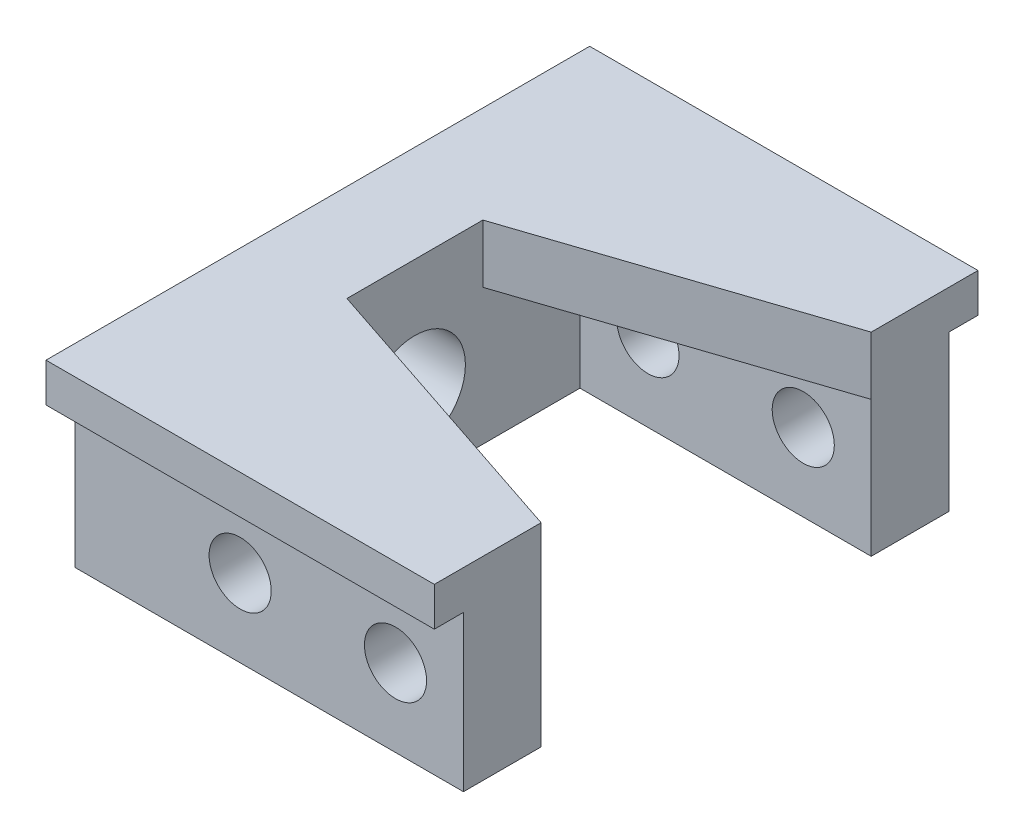
ISO-10303-21;
HEADER;
FILE_DESCRIPTION(('STEP AP214'),'2;1');
FILE_NAME('part.step','',(''),(''),'','','');
FILE_SCHEMA(('AUTOMOTIVE_DESIGN { 1 0 10303 214 1 1 1 1 }'));
ENDSEC;
DATA;
#1=APPLICATION_CONTEXT('core data for automotive mechanical design processes');
#2=APPLICATION_PROTOCOL_DEFINITION('international standard','automotive_design',2000,#1);
#3=PRODUCT_CONTEXT('',#1,'mechanical');
#4=PRODUCT('Part','Part','',(#3));
#5=PRODUCT_RELATED_PRODUCT_CATEGORY('part','',(#4));
#6=PRODUCT_DEFINITION_FORMATION('','',#4);
#7=PRODUCT_DEFINITION_CONTEXT('part definition',#1,'design');
#8=PRODUCT_DEFINITION('design','',#6,#7);
#9=PRODUCT_DEFINITION_SHAPE('','',#8);
#10=(LENGTH_UNIT() NAMED_UNIT(*) SI_UNIT(.MILLI.,.METRE.));
#11=(NAMED_UNIT(*) PLANE_ANGLE_UNIT() SI_UNIT($,.RADIAN.));
#12=(NAMED_UNIT(*) SI_UNIT($,.STERADIAN.) SOLID_ANGLE_UNIT());
#13=UNCERTAINTY_MEASURE_WITH_UNIT(LENGTH_MEASURE(1.E-05),#10,'distance_accuracy_value','');
#14=(GEOMETRIC_REPRESENTATION_CONTEXT(3) GLOBAL_UNCERTAINTY_ASSIGNED_CONTEXT((#13)) GLOBAL_UNIT_ASSIGNED_CONTEXT((#10,
#11,#12)) REPRESENTATION_CONTEXT('',''));
#15=CARTESIAN_POINT('',(0.,0.,0.));
#16=DIRECTION('',(0.,0.,1.));
#17=DIRECTION('',(1.,0.,0.));
#18=AXIS2_PLACEMENT_3D('',#15,#16,#17);
#19=CARTESIAN_POINT('',(5.,0.,0.));
#20=DIRECTION('',(1.,0.,0.));
#21=DIRECTION('',(0.,0.,-1.));
#22=AXIS2_PLACEMENT_3D('',#19,#20,#21);
#23=PLANE('',#22);
#24=DIRECTION('',(0.,0.,1.));
#25=VECTOR('',#24,1.);
#26=CARTESIAN_POINT('',(5.,-2.5,0.));
#27=LINE('',#26,#25);
#28=CARTESIAN_POINT('',(5.,-2.5,-8.5));
#29=VERTEX_POINT('',#28);
#30=CARTESIAN_POINT('',(5.,-2.5,8.5));
#31=VERTEX_POINT('',#30);
#32=EDGE_CURVE('E314',#29,#31,#27,.T.);
#33=ORIENTED_EDGE('',*,*,#32,.F.);
#34=DIRECTION('',(0.,-1.,0.));
#35=VECTOR('',#34,1.);
#36=CARTESIAN_POINT('',(5.,-5.5,-8.5));
#37=LINE('',#36,#35);
#38=CARTESIAN_POINT('',(5.,4.5,-8.5));
#39=VERTEX_POINT('',#38);
#40=EDGE_CURVE('E177',#39,#29,#37,.T.);
#41=ORIENTED_EDGE('',*,*,#40,.F.);
#42=DIRECTION('',(0.,0.,-1.));
#43=VECTOR('',#42,1.);
#44=CARTESIAN_POINT('',(5.,4.5,-8.5));
#45=LINE('',#44,#43);
#46=CARTESIAN_POINT('',(5.,4.5,-3.5));
#47=VERTEX_POINT('',#46);
#48=EDGE_CURVE('E291',#47,#39,#45,.T.);
#49=ORIENTED_EDGE('',*,*,#48,.F.);
#50=DIRECTION('',(0.,1.,0.));
#51=VECTOR('',#50,1.);
#52=CARTESIAN_POINT('',(5.,4.5,-3.5));
#53=LINE('',#52,#51);
#54=CARTESIAN_POINT('',(5.,7.5,-3.5));
#55=VERTEX_POINT('',#54);
#56=EDGE_CURVE('E289',#47,#55,#53,.T.);
#57=ORIENTED_EDGE('',*,*,#56,.T.);
#58=DIRECTION('',(0.,0.,-1.));
#59=VECTOR('',#58,1.);
#60=CARTESIAN_POINT('',(5.,7.5,-8.5));
#61=LINE('',#60,#59);
#62=CARTESIAN_POINT('',(5.,7.5,3.5));
#63=VERTEX_POINT('',#62);
#64=EDGE_CURVE('E245',#63,#55,#61,.T.);
#65=ORIENTED_EDGE('',*,*,#64,.F.);
#66=DIRECTION('',(0.,1.,0.));
#67=VECTOR('',#66,1.);
#68=CARTESIAN_POINT('',(5.,4.5,3.5));
#69=LINE('',#68,#67);
#70=CARTESIAN_POINT('',(5.,4.5,3.5));
#71=VERTEX_POINT('',#70);
#72=EDGE_CURVE('E242',#71,#63,#69,.T.);
#73=ORIENTED_EDGE('',*,*,#72,.F.);
#74=DIRECTION('',(0.,0.,-1.));
#75=VECTOR('',#74,1.);
#76=CARTESIAN_POINT('',(5.,4.5,8.5));
#77=LINE('',#76,#75);
#78=CARTESIAN_POINT('',(5.,4.5,8.5));
#79=VERTEX_POINT('',#78);
#80=EDGE_CURVE('E305',#79,#71,#77,.T.);
#81=ORIENTED_EDGE('',*,*,#80,.F.);
#82=DIRECTION('',(0.,1.,0.));
#83=VECTOR('',#82,1.);
#84=CARTESIAN_POINT('',(5.,-5.5,8.5));
#85=LINE('',#84,#83);
#86=EDGE_CURVE('E170',#31,#79,#85,.T.);
#87=ORIENTED_EDGE('',*,*,#86,.F.);
#88=EDGE_LOOP('',(#33,#41,#49,#57,#65,#73,#81,#87));
#89=FACE_BOUND('',#88,.T.);
#90=CARTESIAN_POINT('',(5.,1.5,0.));
#91=DIRECTION('',(1.,0.,0.));
#92=DIRECTION('',(0.,0.,-1.));
#93=AXIS2_PLACEMENT_3D('',#90,#91,#92);
#94=CIRCLE('',#93,2.6);
#95=CARTESIAN_POINT('',(5.,1.5,-2.6));
#96=VERTEX_POINT('',#95);
#97=EDGE_CURVE('E180',#96,#96,#94,.T.);
#98=ORIENTED_EDGE('',*,*,#97,.F.);
#99=EDGE_LOOP('',(#98));
#100=FACE_BOUND('',#99,.T.);
#101=ADVANCED_FACE('F36',(#89,#100),#23,.T.);
#102=CARTESIAN_POINT('',(20.,-5.5,-8.5));
#103=DIRECTION('',(0.,0.,-1.));
#104=DIRECTION('',(-1.,0.,0.));
#105=AXIS2_PLACEMENT_3D('',#102,#103,#104);
#106=PLANE('',#105);
#107=CARTESIAN_POINT('',(8.5,1.5,-8.5));
#108=DIRECTION('',(0.,0.,-1.));
#109=DIRECTION('',(-1.,0.,0.));
#110=AXIS2_PLACEMENT_3D('',#107,#108,#109);
#111=CIRCLE('',#110,1.6);
#112=CARTESIAN_POINT('',(6.9,1.5,-8.5));
#113=VERTEX_POINT('',#112);
#114=EDGE_CURVE('E188',#113,#113,#111,.T.);
#115=ORIENTED_EDGE('',*,*,#114,.T.);
#116=EDGE_LOOP('',(#115));
#117=FACE_BOUND('',#116,.T.);
#118=CARTESIAN_POINT('',(16.5,1.5,-8.5));
#119=DIRECTION('',(0.,0.,-1.));
#120=DIRECTION('',(-1.,0.,0.));
#121=AXIS2_PLACEMENT_3D('',#118,#119,#120);
#122=CIRCLE('',#121,1.6);
#123=CARTESIAN_POINT('',(14.9,1.5,-8.5));
#124=VERTEX_POINT('',#123);
#125=EDGE_CURVE('E40',#124,#124,#122,.T.);
#126=ORIENTED_EDGE('',*,*,#125,.T.);
#127=EDGE_LOOP('',(#126));
#128=FACE_BOUND('',#127,.T.);
#129=ORIENTED_EDGE('',*,*,#40,.T.);
#130=DIRECTION('',(1.,0.,0.));
#131=VECTOR('',#130,1.);
#132=CARTESIAN_POINT('',(20.,-2.5,-8.5));
#133=LINE('',#132,#131);
#134=CARTESIAN_POINT('',(20.,-2.5,-8.5));
#135=VERTEX_POINT('',#134);
#136=EDGE_CURVE('E319',#29,#135,#133,.T.);
#137=ORIENTED_EDGE('',*,*,#136,.T.);
#138=DIRECTION('',(0.,-1.,0.));
#139=VECTOR('',#138,1.);
#140=CARTESIAN_POINT('',(20.,-5.5,-8.5));
#141=LINE('',#140,#139);
#142=CARTESIAN_POINT('',(20.,4.5,-8.5));
#143=VERTEX_POINT('',#142);
#144=EDGE_CURVE('E218',#143,#135,#141,.T.);
#145=ORIENTED_EDGE('',*,*,#144,.F.);
#146=DIRECTION('',(1.,0.,0.));
#147=VECTOR('',#146,1.);
#148=CARTESIAN_POINT('',(20.,4.5,-8.5));
#149=LINE('',#148,#147);
#150=EDGE_CURVE('E326',#39,#143,#149,.T.);
#151=ORIENTED_EDGE('',*,*,#150,.F.);
#152=EDGE_LOOP('',(#129,#137,#145,#151));
#153=FACE_BOUND('',#152,.T.);
#154=ADVANCED_FACE('F343',(#117,#128,#153),#106,.F.);
#155=CARTESIAN_POINT('',(20.,-5.5,8.5));
#156=DIRECTION('',(0.,0.,1.));
#157=DIRECTION('',(1.,0.,0.));
#158=AXIS2_PLACEMENT_3D('',#155,#156,#157);
#159=PLANE('',#158);
#160=CARTESIAN_POINT('',(8.5,1.5,8.5));
#161=DIRECTION('',(0.,0.,1.));
#162=DIRECTION('',(1.,0.,0.));
#163=AXIS2_PLACEMENT_3D('',#160,#161,#162);
#164=CIRCLE('',#163,1.6);
#165=CARTESIAN_POINT('',(10.1,1.5,8.5));
#166=VERTEX_POINT('',#165);
#167=EDGE_CURVE('E190',#166,#166,#164,.T.);
#168=ORIENTED_EDGE('',*,*,#167,.T.);
#169=EDGE_LOOP('',(#168));
#170=FACE_BOUND('',#169,.T.);
#171=CARTESIAN_POINT('',(16.5,1.5,8.5));
#172=DIRECTION('',(0.,0.,1.));
#173=DIRECTION('',(1.,0.,0.));
#174=AXIS2_PLACEMENT_3D('',#171,#172,#173);
#175=CIRCLE('',#174,1.6);
#176=CARTESIAN_POINT('',(18.1,1.5,8.5));
#177=VERTEX_POINT('',#176);
#178=EDGE_CURVE('E213',#177,#177,#175,.T.);
#179=ORIENTED_EDGE('',*,*,#178,.T.);
#180=EDGE_LOOP('',(#179));
#181=FACE_BOUND('',#180,.T.);
#182=DIRECTION('',(0.,1.,0.));
#183=VECTOR('',#182,1.);
#184=CARTESIAN_POINT('',(20.,-5.5,8.5));
#185=LINE('',#184,#183);
#186=CARTESIAN_POINT('',(20.,-2.5,8.5));
#187=VERTEX_POINT('',#186);
#188=CARTESIAN_POINT('',(20.,4.5,8.5));
#189=VERTEX_POINT('',#188);
#190=EDGE_CURVE('E169',#187,#189,#185,.T.);
#191=ORIENTED_EDGE('',*,*,#190,.F.);
#192=DIRECTION('',(-1.,0.,0.));
#193=VECTOR('',#192,1.);
#194=CARTESIAN_POINT('',(20.,-2.5,8.5));
#195=LINE('',#194,#193);
#196=EDGE_CURVE('E150',#187,#31,#195,.T.);
#197=ORIENTED_EDGE('',*,*,#196,.T.);
#198=ORIENTED_EDGE('',*,*,#86,.T.);
#199=DIRECTION('',(-1.,0.,0.));
#200=VECTOR('',#199,1.);
#201=CARTESIAN_POINT('',(20.,4.5,8.5));
#202=LINE('',#201,#200);
#203=EDGE_CURVE('E302',#189,#79,#202,.T.);
#204=ORIENTED_EDGE('',*,*,#203,.F.);
#205=EDGE_LOOP('',(#191,#197,#198,#204));
#206=FACE_BOUND('',#205,.T.);
#207=ADVANCED_FACE('F317',(#170,#181,#206),#159,.F.);
#208=CARTESIAN_POINT('',(0.,0.,0.));
#209=DIRECTION('',(1.,0.,0.));
#210=DIRECTION('',(0.,0.,-1.));
#211=AXIS2_PLACEMENT_3D('',#208,#209,#210);
#212=PLANE('',#211);
#213=DIRECTION('',(0.,1.,0.));
#214=VECTOR('',#213,1.);
#215=CARTESIAN_POINT('',(0.,-5.5,-12.5));
#216=LINE('',#215,#214);
#217=CARTESIAN_POINT('',(0.,-2.5,-12.5));
#218=VERTEX_POINT('',#217);
#219=CARTESIAN_POINT('',(0.,5.5,-12.5));
#220=VERTEX_POINT('',#219);
#221=EDGE_CURVE('E186',#218,#220,#216,.T.);
#222=ORIENTED_EDGE('',*,*,#221,.F.);
#223=DIRECTION('',(0.,0.,-1.));
#224=VECTOR('',#223,1.);
#225=CARTESIAN_POINT('',(0.,-2.5,-12.5));
#226=LINE('',#225,#224);
#227=CARTESIAN_POINT('',(0.,-2.5,12.5));
#228=VERTEX_POINT('',#227);
#229=EDGE_CURVE('E162',#228,#218,#226,.T.);
#230=ORIENTED_EDGE('',*,*,#229,.F.);
#231=DIRECTION('',(0.,-1.,0.));
#232=VECTOR('',#231,1.);
#233=CARTESIAN_POINT('',(0.,-5.5,12.5));
#234=LINE('',#233,#232);
#235=CARTESIAN_POINT('',(0.,5.5,12.5));
#236=VERTEX_POINT('',#235);
#237=EDGE_CURVE('E161',#236,#228,#234,.T.);
#238=ORIENTED_EDGE('',*,*,#237,.F.);
#239=DIRECTION('',(0.,0.,1.));
#240=VECTOR('',#239,1.);
#241=CARTESIAN_POINT('',(0.,5.5,8.5));
#242=LINE('',#241,#240);
#243=CARTESIAN_POINT('',(0.,5.5,14.));
#244=VERTEX_POINT('',#243);
#245=EDGE_CURVE('E239',#236,#244,#242,.T.);
#246=ORIENTED_EDGE('',*,*,#245,.T.);
#247=DIRECTION('',(0.,-1.,0.));
#248=VECTOR('',#247,1.);
#249=CARTESIAN_POINT('',(0.,7.5,14.));
#250=LINE('',#249,#248);
#251=CARTESIAN_POINT('',(0.,7.5,14.));
#252=VERTEX_POINT('',#251);
#253=EDGE_CURVE('E256',#252,#244,#250,.T.);
#254=ORIENTED_EDGE('',*,*,#253,.F.);
#255=DIRECTION('',(0.,0.,1.));
#256=VECTOR('',#255,1.);
#257=CARTESIAN_POINT('',(0.,7.5,-8.5));
#258=LINE('',#257,#256);
#259=CARTESIAN_POINT('',(0.,7.5,-14.));
#260=VERTEX_POINT('',#259);
#261=EDGE_CURVE('E270',#260,#252,#258,.T.);
#262=ORIENTED_EDGE('',*,*,#261,.F.);
#263=DIRECTION('',(0.,-1.,0.));
#264=VECTOR('',#263,1.);
#265=CARTESIAN_POINT('',(0.,7.5,-14.));
#266=LINE('',#265,#264);
#267=CARTESIAN_POINT('',(0.,5.5,-14.));
#268=VERTEX_POINT('',#267);
#269=EDGE_CURVE('E258',#260,#268,#266,.T.);
#270=ORIENTED_EDGE('',*,*,#269,.T.);
#271=EDGE_CURVE('E248',#268,#220,#242,.T.);
#272=ORIENTED_EDGE('',*,*,#271,.T.);
#273=EDGE_LOOP('',(#222,#230,#238,#246,#254,#262,#270,#272));
#274=FACE_BOUND('',#273,.T.);
#275=CARTESIAN_POINT('',(0.,1.5,0.));
#276=DIRECTION('',(1.,0.,0.));
#277=DIRECTION('',(0.,0.,-1.));
#278=AXIS2_PLACEMENT_3D('',#275,#276,#277);
#279=CIRCLE('',#278,2.6);
#280=CARTESIAN_POINT('',(0.,1.5,-2.6));
#281=VERTEX_POINT('',#280);
#282=EDGE_CURVE('E172',#281,#281,#279,.T.);
#283=ORIENTED_EDGE('',*,*,#282,.T.);
#284=EDGE_LOOP('',(#283));
#285=FACE_BOUND('',#284,.T.);
#286=ADVANCED_FACE('F353',(#274,#285),#212,.F.);
#287=CARTESIAN_POINT('',(5.,-5.5,12.5));
#288=DIRECTION('',(0.,0.,-1.));
#289=DIRECTION('',(-1.,0.,0.));
#290=AXIS2_PLACEMENT_3D('',#287,#288,#289);
#291=PLANE('',#290);
#292=CARTESIAN_POINT('',(16.5,1.5,12.5));
#293=DIRECTION('',(0.,0.,1.));
#294=DIRECTION('',(1.,0.,0.));
#295=AXIS2_PLACEMENT_3D('',#292,#293,#294);
#296=CIRCLE('',#295,1.6);
#297=CARTESIAN_POINT('',(18.1,1.5,12.5));
#298=VERTEX_POINT('',#297);
#299=EDGE_CURVE('E197',#298,#298,#296,.T.);
#300=ORIENTED_EDGE('',*,*,#299,.F.);
#301=EDGE_LOOP('',(#300));
#302=FACE_BOUND('',#301,.T.);
#303=CARTESIAN_POINT('',(8.5,1.5,12.5));
#304=DIRECTION('',(0.,0.,1.));
#305=DIRECTION('',(1.,0.,0.));
#306=AXIS2_PLACEMENT_3D('',#303,#304,#305);
#307=CIRCLE('',#306,1.6);
#308=CARTESIAN_POINT('',(10.1,1.5,12.5));
#309=VERTEX_POINT('',#308);
#310=EDGE_CURVE('E210',#309,#309,#307,.T.);
#311=ORIENTED_EDGE('',*,*,#310,.F.);
#312=EDGE_LOOP('',(#311));
#313=FACE_BOUND('',#312,.T.);
#314=ORIENTED_EDGE('',*,*,#237,.T.);
#315=DIRECTION('',(-1.,0.,0.));
#316=VECTOR('',#315,1.);
#317=CARTESIAN_POINT('',(0.,-2.5,12.5));
#318=LINE('',#317,#316);
#319=CARTESIAN_POINT('',(20.,-2.5,12.5));
#320=VERTEX_POINT('',#319);
#321=EDGE_CURVE('E147',#320,#228,#318,.T.);
#322=ORIENTED_EDGE('',*,*,#321,.F.);
#323=DIRECTION('',(0.,-1.,0.));
#324=VECTOR('',#323,1.);
#325=CARTESIAN_POINT('',(20.,-5.5,12.5));
#326=LINE('',#325,#324);
#327=CARTESIAN_POINT('',(20.,5.5,12.5));
#328=VERTEX_POINT('',#327);
#329=EDGE_CURVE('E158',#328,#320,#326,.T.);
#330=ORIENTED_EDGE('',*,*,#329,.F.);
#331=DIRECTION('',(-1.,0.,0.));
#332=VECTOR('',#331,1.);
#333=CARTESIAN_POINT('',(5.,5.5,12.5));
#334=LINE('',#333,#332);
#335=EDGE_CURVE('E45',#328,#236,#334,.T.);
#336=ORIENTED_EDGE('',*,*,#335,.T.);
#337=EDGE_LOOP('',(#314,#322,#330,#336));
#338=FACE_BOUND('',#337,.T.);
#339=ADVANCED_FACE('F38',(#302,#313,#338),#291,.F.);
#340=CARTESIAN_POINT('',(5.,-5.5,-12.5));
#341=DIRECTION('',(0.,0.,1.));
#342=DIRECTION('',(1.,0.,0.));
#343=AXIS2_PLACEMENT_3D('',#340,#341,#342);
#344=PLANE('',#343);
#345=CARTESIAN_POINT('',(16.5,1.5,-12.5));
#346=DIRECTION('',(0.,0.,1.));
#347=DIRECTION('',(1.,0.,0.));
#348=AXIS2_PLACEMENT_3D('',#345,#346,#347);
#349=CIRCLE('',#348,1.6);
#350=CARTESIAN_POINT('',(18.1,1.5,-12.5));
#351=VERTEX_POINT('',#350);
#352=EDGE_CURVE('E191',#351,#351,#349,.T.);
#353=ORIENTED_EDGE('',*,*,#352,.T.);
#354=EDGE_LOOP('',(#353));
#355=FACE_BOUND('',#354,.T.);
#356=CARTESIAN_POINT('',(8.5,1.5,-12.5));
#357=DIRECTION('',(0.,0.,1.));
#358=DIRECTION('',(1.,0.,0.));
#359=AXIS2_PLACEMENT_3D('',#356,#357,#358);
#360=CIRCLE('',#359,1.6);
#361=CARTESIAN_POINT('',(10.1,1.5,-12.5));
#362=VERTEX_POINT('',#361);
#363=EDGE_CURVE('E202',#362,#362,#360,.T.);
#364=ORIENTED_EDGE('',*,*,#363,.T.);
#365=EDGE_LOOP('',(#364));
#366=FACE_BOUND('',#365,.T.);
#367=DIRECTION('',(0.,1.,0.));
#368=VECTOR('',#367,1.);
#369=CARTESIAN_POINT('',(20.,-5.5,-12.5));
#370=LINE('',#369,#368);
#371=CARTESIAN_POINT('',(20.,-2.5,-12.5));
#372=VERTEX_POINT('',#371);
#373=CARTESIAN_POINT('',(20.,5.5,-12.5));
#374=VERTEX_POINT('',#373);
#375=EDGE_CURVE('E174',#372,#374,#370,.T.);
#376=ORIENTED_EDGE('',*,*,#375,.F.);
#377=DIRECTION('',(1.,0.,0.));
#378=VECTOR('',#377,1.);
#379=CARTESIAN_POINT('',(0.,-2.5,-12.5));
#380=LINE('',#379,#378);
#381=EDGE_CURVE('E53',#218,#372,#380,.T.);
#382=ORIENTED_EDGE('',*,*,#381,.F.);
#383=ORIENTED_EDGE('',*,*,#221,.T.);
#384=DIRECTION('',(-1.,0.,0.));
#385=VECTOR('',#384,1.);
#386=CARTESIAN_POINT('',(5.,5.5,-12.5));
#387=LINE('',#386,#385);
#388=EDGE_CURVE('E11',#374,#220,#387,.T.);
#389=ORIENTED_EDGE('',*,*,#388,.F.);
#390=EDGE_LOOP('',(#376,#382,#383,#389));
#391=FACE_BOUND('',#390,.T.);
#392=ADVANCED_FACE('F229',(#355,#366,#391),#344,.F.);
#393=CARTESIAN_POINT('',(5.,1.5,0.));
#394=DIRECTION('',(-1.,0.,0.));
#395=DIRECTION('',(0.,0.,1.));
#396=AXIS2_PLACEMENT_3D('',#393,#394,#395);
#397=CYLINDRICAL_SURFACE('',#396,2.6);
#398=ORIENTED_EDGE('',*,*,#97,.T.);
#399=EDGE_LOOP('',(#398));
#400=FACE_BOUND('',#399,.T.);
#401=ORIENTED_EDGE('',*,*,#282,.F.);
#402=EDGE_LOOP('',(#401));
#403=FACE_BOUND('',#402,.T.);
#404=ADVANCED_FACE('F351',(#400,#403),#397,.F.);
#405=CARTESIAN_POINT('',(20.,0.,0.));
#406=DIRECTION('',(1.,0.,0.));
#407=DIRECTION('',(0.,0.,-1.));
#408=AXIS2_PLACEMENT_3D('',#405,#406,#407);
#409=PLANE('',#408);
#410=DIRECTION('',(0.,0.,1.));
#411=VECTOR('',#410,1.);
#412=CARTESIAN_POINT('',(20.,-2.5,-12.5));
#413=LINE('',#412,#411);
#414=EDGE_CURVE('E144',#187,#320,#413,.T.);
#415=ORIENTED_EDGE('',*,*,#414,.F.);
#416=ORIENTED_EDGE('',*,*,#190,.T.);
#417=DIRECTION('',(0.,1.,0.));
#418=VECTOR('',#417,1.);
#419=CARTESIAN_POINT('',(20.,4.5,8.5));
#420=LINE('',#419,#418);
#421=CARTESIAN_POINT('',(20.,7.5,8.5));
#422=VERTEX_POINT('',#421);
#423=EDGE_CURVE('E237',#189,#422,#420,.T.);
#424=ORIENTED_EDGE('',*,*,#423,.T.);
#425=DIRECTION('',(0.,0.,-1.));
#426=VECTOR('',#425,1.);
#427=CARTESIAN_POINT('',(20.,7.5,14.));
#428=LINE('',#427,#426);
#429=CARTESIAN_POINT('',(20.,7.5,14.));
#430=VERTEX_POINT('',#429);
#431=EDGE_CURVE('E276',#430,#422,#428,.T.);
#432=ORIENTED_EDGE('',*,*,#431,.F.);
#433=DIRECTION('',(0.,-1.,0.));
#434=VECTOR('',#433,1.);
#435=CARTESIAN_POINT('',(20.,7.5,14.));
#436=LINE('',#435,#434);
#437=CARTESIAN_POINT('',(20.,5.5,14.));
#438=VERTEX_POINT('',#437);
#439=EDGE_CURVE('E254',#430,#438,#436,.T.);
#440=ORIENTED_EDGE('',*,*,#439,.T.);
#441=DIRECTION('',(0.,0.,-1.));
#442=VECTOR('',#441,1.);
#443=CARTESIAN_POINT('',(20.,5.5,14.));
#444=LINE('',#443,#442);
#445=EDGE_CURVE('E168',#438,#328,#444,.T.);
#446=ORIENTED_EDGE('',*,*,#445,.T.);
#447=ORIENTED_EDGE('',*,*,#329,.T.);
#448=EDGE_LOOP('',(#415,#416,#424,#432,#440,#446,#447));
#449=FACE_BOUND('',#448,.T.);
#450=ADVANCED_FACE('F165',(#449),#409,.T.);
#451=CARTESIAN_POINT('',(20.,0.,0.));
#452=DIRECTION('',(-1.,0.,0.));
#453=DIRECTION('',(0.,0.,1.));
#454=AXIS2_PLACEMENT_3D('',#451,#452,#453);
#455=PLANE('',#454);
#456=ORIENTED_EDGE('',*,*,#144,.T.);
#457=EDGE_CURVE('E154',#372,#135,#413,.T.);
#458=ORIENTED_EDGE('',*,*,#457,.F.);
#459=ORIENTED_EDGE('',*,*,#375,.T.);
#460=DIRECTION('',(0.,0.,-1.));
#461=VECTOR('',#460,1.);
#462=CARTESIAN_POINT('',(20.,5.5,-14.));
#463=LINE('',#462,#461);
#464=CARTESIAN_POINT('',(20.,5.5,-14.));
#465=VERTEX_POINT('',#464);
#466=EDGE_CURVE('E226',#374,#465,#463,.T.);
#467=ORIENTED_EDGE('',*,*,#466,.T.);
#468=DIRECTION('',(0.,-1.,0.));
#469=VECTOR('',#468,1.);
#470=CARTESIAN_POINT('',(20.,7.5,-14.));
#471=LINE('',#470,#469);
#472=CARTESIAN_POINT('',(20.,7.5,-14.));
#473=VERTEX_POINT('',#472);
#474=EDGE_CURVE('E205',#473,#465,#471,.T.);
#475=ORIENTED_EDGE('',*,*,#474,.F.);
#476=DIRECTION('',(0.,0.,-1.));
#477=VECTOR('',#476,1.);
#478=CARTESIAN_POINT('',(20.,7.5,-14.));
#479=LINE('',#478,#477);
#480=CARTESIAN_POINT('',(20.,7.5,-8.5));
#481=VERTEX_POINT('',#480);
#482=EDGE_CURVE('E253',#481,#473,#479,.T.);
#483=ORIENTED_EDGE('',*,*,#482,.F.);
#484=EDGE_CURVE('E216',#481,#143,#141,.T.);
#485=ORIENTED_EDGE('',*,*,#484,.T.);
#486=EDGE_LOOP('',(#456,#458,#459,#467,#475,#483,#485));
#487=FACE_BOUND('',#486,.T.);
#488=ADVANCED_FACE('F223',(#487),#455,.F.);
#489=CARTESIAN_POINT('',(8.5,1.5,-12.5));
#490=DIRECTION('',(0.,0.,1.));
#491=DIRECTION('',(1.,0.,0.));
#492=AXIS2_PLACEMENT_3D('',#489,#490,#491);
#493=CYLINDRICAL_SURFACE('',#492,1.6);
#494=ORIENTED_EDGE('',*,*,#363,.F.);
#495=EDGE_LOOP('',(#494));
#496=FACE_BOUND('',#495,.T.);
#497=ORIENTED_EDGE('',*,*,#114,.F.);
#498=EDGE_LOOP('',(#497));
#499=FACE_BOUND('',#498,.T.);
#500=ADVANCED_FACE('F365',(#496,#499),#493,.F.);
#501=CARTESIAN_POINT('',(16.5,1.5,-12.5));
#502=DIRECTION('',(0.,0.,1.));
#503=DIRECTION('',(1.,0.,0.));
#504=AXIS2_PLACEMENT_3D('',#501,#502,#503);
#505=CYLINDRICAL_SURFACE('',#504,1.6);
#506=ORIENTED_EDGE('',*,*,#352,.F.);
#507=EDGE_LOOP('',(#506));
#508=FACE_BOUND('',#507,.T.);
#509=ORIENTED_EDGE('',*,*,#125,.F.);
#510=EDGE_LOOP('',(#509));
#511=FACE_BOUND('',#510,.T.);
#512=ADVANCED_FACE('F368',(#508,#511),#505,.F.);
#513=ORIENTED_EDGE('',*,*,#310,.T.);
#514=EDGE_LOOP('',(#513));
#515=FACE_BOUND('',#514,.T.);
#516=ORIENTED_EDGE('',*,*,#167,.F.);
#517=EDGE_LOOP('',(#516));
#518=FACE_BOUND('',#517,.T.);
#519=ADVANCED_FACE('F370',(#515,#518),#493,.F.);
#520=ORIENTED_EDGE('',*,*,#299,.T.);
#521=EDGE_LOOP('',(#520));
#522=FACE_BOUND('',#521,.T.);
#523=ORIENTED_EDGE('',*,*,#178,.F.);
#524=EDGE_LOOP('',(#523));
#525=FACE_BOUND('',#524,.T.);
#526=ADVANCED_FACE('F377',(#522,#525),#505,.F.);
#527=CARTESIAN_POINT('',(0.,5.5,0.));
#528=DIRECTION('',(0.,-1.,0.));
#529=DIRECTION('',(0.,0.,-1.));
#530=AXIS2_PLACEMENT_3D('',#527,#528,#529);
#531=PLANE('',#530);
#532=ORIENTED_EDGE('',*,*,#335,.F.);
#533=ORIENTED_EDGE('',*,*,#445,.F.);
#534=DIRECTION('',(1.,0.,0.));
#535=VECTOR('',#534,1.);
#536=CARTESIAN_POINT('',(0.,5.5,14.));
#537=LINE('',#536,#535);
#538=EDGE_CURVE('E250',#244,#438,#537,.T.);
#539=ORIENTED_EDGE('',*,*,#538,.F.);
#540=ORIENTED_EDGE('',*,*,#245,.F.);
#541=EDGE_LOOP('',(#532,#533,#539,#540));
#542=FACE_BOUND('',#541,.T.);
#543=ADVANCED_FACE('F384',(#542),#531,.T.);
#544=CARTESIAN_POINT('',(0.,7.5,-14.));
#545=DIRECTION('',(0.,0.,1.));
#546=DIRECTION('',(0.,-1.,0.));
#547=AXIS2_PLACEMENT_3D('',#544,#545,#546);
#548=PLANE('',#547);
#549=DIRECTION('',(-1.,0.,0.));
#550=VECTOR('',#549,1.);
#551=CARTESIAN_POINT('',(0.,5.5,-14.));
#552=LINE('',#551,#550);
#553=EDGE_CURVE('E235',#465,#268,#552,.T.);
#554=ORIENTED_EDGE('',*,*,#553,.T.);
#555=ORIENTED_EDGE('',*,*,#269,.F.);
#556=DIRECTION('',(-1.,0.,0.));
#557=VECTOR('',#556,1.);
#558=CARTESIAN_POINT('',(0.,7.5,-14.));
#559=LINE('',#558,#557);
#560=EDGE_CURVE('E265',#473,#260,#559,.T.);
#561=ORIENTED_EDGE('',*,*,#560,.F.);
#562=ORIENTED_EDGE('',*,*,#474,.T.);
#563=EDGE_LOOP('',(#554,#555,#561,#562));
#564=FACE_BOUND('',#563,.T.);
#565=ADVANCED_FACE('F264',(#564),#548,.F.);
#566=CARTESIAN_POINT('',(0.,7.5,14.));
#567=DIRECTION('',(0.,0.,-1.));
#568=DIRECTION('',(0.,1.,0.));
#569=AXIS2_PLACEMENT_3D('',#566,#567,#568);
#570=PLANE('',#569);
#571=ORIENTED_EDGE('',*,*,#538,.T.);
#572=ORIENTED_EDGE('',*,*,#439,.F.);
#573=DIRECTION('',(1.,0.,0.));
#574=VECTOR('',#573,1.);
#575=CARTESIAN_POINT('',(0.,7.5,14.));
#576=LINE('',#575,#574);
#577=EDGE_CURVE('E275',#252,#430,#576,.T.);
#578=ORIENTED_EDGE('',*,*,#577,.F.);
#579=ORIENTED_EDGE('',*,*,#253,.T.);
#580=EDGE_LOOP('',(#571,#572,#578,#579));
#581=FACE_BOUND('',#580,.T.);
#582=ADVANCED_FACE('F519',(#581),#570,.F.);
#583=CARTESIAN_POINT('',(0.,7.5,0.));
#584=DIRECTION('',(0.,-1.,0.));
#585=DIRECTION('',(0.,0.,-1.));
#586=AXIS2_PLACEMENT_3D('',#583,#584,#585);
#587=PLANE('',#586);
#588=DIRECTION('',(-0.948683298050514,0.,0.316227766016838));
#589=VECTOR('',#588,1.);
#590=CARTESIAN_POINT('',(5.,7.5,-3.5));
#591=LINE('',#590,#589);
#592=EDGE_CURVE('E280',#481,#55,#591,.T.);
#593=ORIENTED_EDGE('',*,*,#592,.F.);
#594=ORIENTED_EDGE('',*,*,#482,.T.);
#595=ORIENTED_EDGE('',*,*,#560,.T.);
#596=ORIENTED_EDGE('',*,*,#261,.T.);
#597=ORIENTED_EDGE('',*,*,#577,.T.);
#598=ORIENTED_EDGE('',*,*,#431,.T.);
#599=DIRECTION('',(0.948683298050514,0.,0.316227766016838));
#600=VECTOR('',#599,1.);
#601=CARTESIAN_POINT('',(5.,7.5,3.5));
#602=LINE('',#601,#600);
#603=EDGE_CURVE('E61',#63,#422,#602,.T.);
#604=ORIENTED_EDGE('',*,*,#603,.F.);
#605=ORIENTED_EDGE('',*,*,#64,.T.);
#606=EDGE_LOOP('',(#593,#594,#595,#596,#597,#598,#604,#605));
#607=FACE_BOUND('',#606,.T.);
#608=ADVANCED_FACE('F279',(#607),#587,.F.);
#609=ORIENTED_EDGE('',*,*,#466,.F.);
#610=ORIENTED_EDGE('',*,*,#388,.T.);
#611=ORIENTED_EDGE('',*,*,#271,.F.);
#612=ORIENTED_EDGE('',*,*,#553,.F.);
#613=EDGE_LOOP('',(#609,#610,#611,#612));
#614=FACE_BOUND('',#613,.T.);
#615=ADVANCED_FACE('F233',(#614),#531,.T.);
#616=CARTESIAN_POINT('',(5.,4.5,3.5));
#617=DIRECTION('',(-0.316227766016838,0.,0.948683298050514));
#618=DIRECTION('',(0.948683298050514,0.,0.316227766016838));
#619=AXIS2_PLACEMENT_3D('',#616,#617,#618);
#620=PLANE('',#619);
#621=ORIENTED_EDGE('',*,*,#603,.T.);
#622=ORIENTED_EDGE('',*,*,#423,.F.);
#623=DIRECTION('',(0.948683298050514,0.,0.316227766016838));
#624=VECTOR('',#623,1.);
#625=CARTESIAN_POINT('',(5.,4.5,3.5));
#626=LINE('',#625,#624);
#627=EDGE_CURVE('E294',#71,#189,#626,.T.);
#628=ORIENTED_EDGE('',*,*,#627,.F.);
#629=ORIENTED_EDGE('',*,*,#72,.T.);
#630=EDGE_LOOP('',(#621,#622,#628,#629));
#631=FACE_BOUND('',#630,.T.);
#632=ADVANCED_FACE('F308',(#631),#620,.F.);
#633=CARTESIAN_POINT('',(0.,4.5,0.));
#634=DIRECTION('',(0.,1.,0.));
#635=DIRECTION('',(0.,0.,1.));
#636=AXIS2_PLACEMENT_3D('',#633,#634,#635);
#637=PLANE('',#636);
#638=ORIENTED_EDGE('',*,*,#627,.T.);
#639=ORIENTED_EDGE('',*,*,#203,.T.);
#640=ORIENTED_EDGE('',*,*,#80,.T.);
#641=EDGE_LOOP('',(#638,#639,#640));
#642=FACE_BOUND('',#641,.T.);
#643=ADVANCED_FACE('F312',(#642),#637,.F.);
#644=CARTESIAN_POINT('',(5.,4.5,-3.5));
#645=DIRECTION('',(-0.316227766016838,0.,-0.948683298050514));
#646=DIRECTION('',(-0.948683298050514,0.,0.316227766016838));
#647=AXIS2_PLACEMENT_3D('',#644,#645,#646);
#648=PLANE('',#647);
#649=ORIENTED_EDGE('',*,*,#592,.T.);
#650=ORIENTED_EDGE('',*,*,#56,.F.);
#651=DIRECTION('',(-0.948683298050514,0.,0.316227766016838));
#652=VECTOR('',#651,1.);
#653=CARTESIAN_POINT('',(5.,4.5,-3.5));
#654=LINE('',#653,#652);
#655=EDGE_CURVE('E296',#143,#47,#654,.T.);
#656=ORIENTED_EDGE('',*,*,#655,.F.);
#657=ORIENTED_EDGE('',*,*,#484,.F.);
#658=EDGE_LOOP('',(#649,#650,#656,#657));
#659=FACE_BOUND('',#658,.T.);
#660=ADVANCED_FACE('F333',(#659),#648,.F.);
#661=CARTESIAN_POINT('',(0.,4.5,0.));
#662=DIRECTION('',(0.,1.,0.));
#663=DIRECTION('',(0.,0.,1.));
#664=AXIS2_PLACEMENT_3D('',#661,#662,#663);
#665=PLANE('',#664);
#666=ORIENTED_EDGE('',*,*,#150,.T.);
#667=ORIENTED_EDGE('',*,*,#655,.T.);
#668=ORIENTED_EDGE('',*,*,#48,.T.);
#669=EDGE_LOOP('',(#666,#667,#668));
#670=FACE_BOUND('',#669,.T.);
#671=ADVANCED_FACE('F330',(#670),#665,.F.);
#672=CARTESIAN_POINT('',(0.,-2.5,0.));
#673=DIRECTION('',(0.,1.,0.));
#674=DIRECTION('',(0.,0.,1.));
#675=AXIS2_PLACEMENT_3D('',#672,#673,#674);
#676=PLANE('',#675);
#677=ORIENTED_EDGE('',*,*,#32,.T.);
#678=ORIENTED_EDGE('',*,*,#196,.F.);
#679=ORIENTED_EDGE('',*,*,#414,.T.);
#680=ORIENTED_EDGE('',*,*,#321,.T.);
#681=ORIENTED_EDGE('',*,*,#229,.T.);
#682=ORIENTED_EDGE('',*,*,#381,.T.);
#683=ORIENTED_EDGE('',*,*,#457,.T.);
#684=ORIENTED_EDGE('',*,*,#136,.F.);
#685=EDGE_LOOP('',(#677,#678,#679,#680,#681,#682,#683,#684));
#686=FACE_BOUND('',#685,.T.);
#687=ADVANCED_FACE('F146',(#686),#676,.F.);
#688=CLOSED_SHELL('',(#101,#154,#207,#286,#339,#392,#404,#450,#488,#500,#512,#519,#526,#543,
#565,#582,#608,#615,#632,#643,#660,#671,#687));
#689=MANIFOLD_SOLID_BREP('B2',#688);
#690=ADVANCED_BREP_SHAPE_REPRESENTATION('',(#18,#689),#14);
#691=SHAPE_DEFINITION_REPRESENTATION(#9,#690);
ENDSEC;
END-ISO-10303-21;
